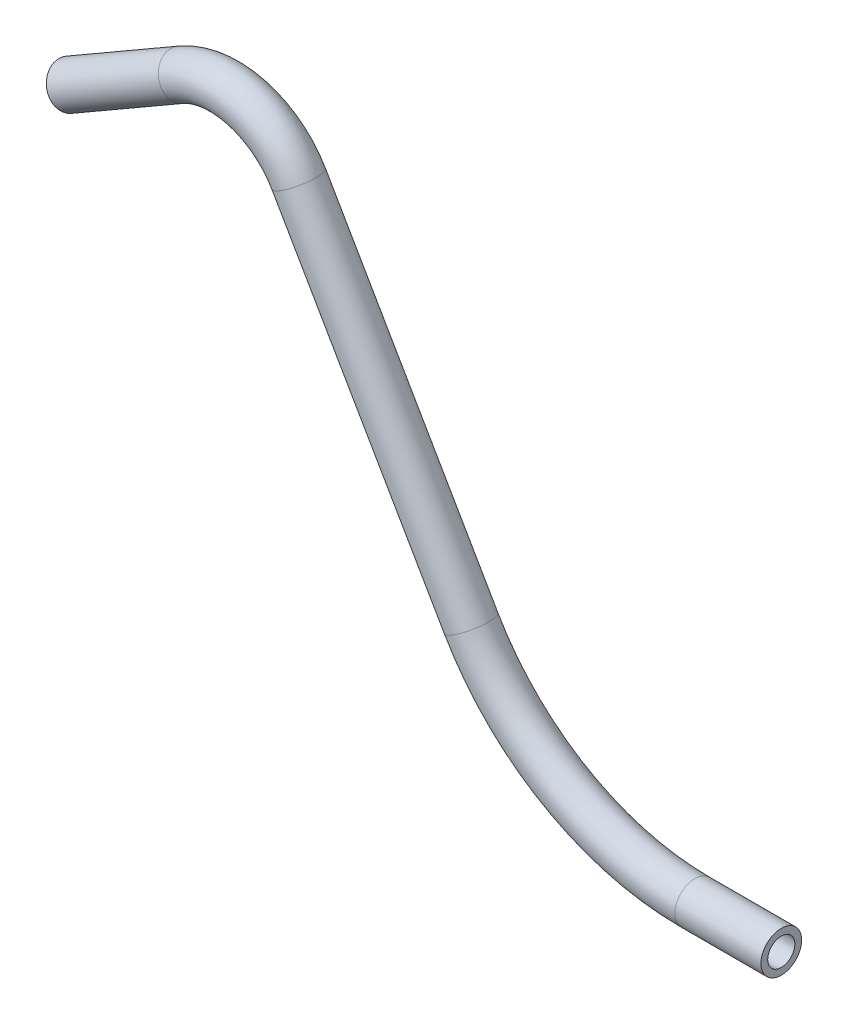
ISO-10303-21;
HEADER;
FILE_DESCRIPTION(('STEP AP214'),'2;1');
FILE_NAME('part.step','',(''),(''),'','','');
FILE_SCHEMA(('AUTOMOTIVE_DESIGN { 1 0 10303 214 1 1 1 1 }'));
ENDSEC;
DATA;
#1=APPLICATION_CONTEXT('core data for automotive mechanical design processes');
#2=APPLICATION_PROTOCOL_DEFINITION('international standard','automotive_design',2000,#1);
#3=PRODUCT_CONTEXT('',#1,'mechanical');
#4=PRODUCT('Part','Part','',(#3));
#5=PRODUCT_RELATED_PRODUCT_CATEGORY('part','',(#4));
#6=PRODUCT_DEFINITION_FORMATION('','',#4);
#7=PRODUCT_DEFINITION_CONTEXT('part definition',#1,'design');
#8=PRODUCT_DEFINITION('design','',#6,#7);
#9=PRODUCT_DEFINITION_SHAPE('','',#8);
#10=(LENGTH_UNIT() NAMED_UNIT(*) SI_UNIT(.MILLI.,.METRE.));
#11=(NAMED_UNIT(*) PLANE_ANGLE_UNIT() SI_UNIT($,.RADIAN.));
#12=(NAMED_UNIT(*) SI_UNIT($,.STERADIAN.) SOLID_ANGLE_UNIT());
#13=UNCERTAINTY_MEASURE_WITH_UNIT(LENGTH_MEASURE(1.E-05),#10,'distance_accuracy_value','');
#14=(GEOMETRIC_REPRESENTATION_CONTEXT(3) GLOBAL_UNCERTAINTY_ASSIGNED_CONTEXT((#13)) GLOBAL_UNIT_ASSIGNED_CONTEXT((#10,
#11,#12)) REPRESENTATION_CONTEXT('',''));
#15=CARTESIAN_POINT('',(0.,0.,0.));
#16=DIRECTION('',(0.,0.,1.));
#17=DIRECTION('',(1.,0.,0.));
#18=AXIS2_PLACEMENT_3D('',#15,#16,#17);
#19=CARTESIAN_POINT('',(-88.4440905122495,67.692613140312,0.));
#20=DIRECTION('',(-0.866025403784438,-0.5,0.));
#21=DIRECTION('',(0.5,-0.866025403784439,0.));
#22=AXIS2_PLACEMENT_3D('',#19,#20,#21);
#23=CYLINDRICAL_SURFACE('',#22,3.);
#24=CARTESIAN_POINT('',(-88.4440905122495,67.692613140312,0.));
#25=DIRECTION('',(0.866025403784439,0.5,0.));
#26=DIRECTION('',(0.,0.,-1.));
#27=AXIS2_PLACEMENT_3D('',#24,#25,#26);
#28=CIRCLE('',#27,3.);
#29=CARTESIAN_POINT('',(-89.9440905122495,70.2906893516653,0.));
#30=VERTEX_POINT('',#29);
#31=EDGE_CURVE('E42',#30,#30,#28,.T.);
#32=ORIENTED_EDGE('',*,*,#31,.F.);
#33=EDGE_LOOP('',(#32));
#34=FACE_BOUND('',#33,.T.);
#35=CARTESIAN_POINT('',(-104.941874454343,58.167613140312,0.));
#36=DIRECTION('',(0.866025403784439,0.5,0.));
#37=DIRECTION('',(0.,0.,-1.));
#38=AXIS2_PLACEMENT_3D('',#35,#36,#37);
#39=CIRCLE('',#38,3.);
#40=CARTESIAN_POINT('',(-104.941874454343,58.167613140312,-3.));
#41=VERTEX_POINT('',#40);
#42=EDGE_CURVE('E10',#41,#41,#39,.T.);
#43=ORIENTED_EDGE('',*,*,#42,.T.);
#44=EDGE_LOOP('',(#43));
#45=FACE_BOUND('',#44,.T.);
#46=ADVANCED_FACE('F32',(#34,#45),#23,.T.);
#47=CARTESIAN_POINT('',(-88.4440905122495,67.692613140312,0.));
#48=DIRECTION('',(-0.866025403784438,-0.5,0.));
#49=DIRECTION('',(0.5,-0.866025403784439,0.));
#50=AXIS2_PLACEMENT_3D('',#47,#48,#49);
#51=CYLINDRICAL_SURFACE('',#50,2.);
#52=CARTESIAN_POINT('',(-88.4440905122495,67.692613140312,0.));
#53=DIRECTION('',(0.866025403784439,0.5,0.));
#54=DIRECTION('',(0.,0.,-1.));
#55=AXIS2_PLACEMENT_3D('',#52,#53,#54);
#56=CIRCLE('',#55,2.);
#57=CARTESIAN_POINT('',(-89.4440905122495,69.4246639478809,0.));
#58=VERTEX_POINT('',#57);
#59=EDGE_CURVE('E46',#58,#58,#56,.T.);
#60=ORIENTED_EDGE('',*,*,#59,.T.);
#61=EDGE_LOOP('',(#60));
#62=FACE_BOUND('',#61,.T.);
#63=CARTESIAN_POINT('',(-104.941874454343,58.167613140312,0.));
#64=DIRECTION('',(0.866025403784439,0.5,0.));
#65=DIRECTION('',(0.,0.,-1.));
#66=AXIS2_PLACEMENT_3D('',#63,#64,#65);
#67=CIRCLE('',#66,2.);
#68=CARTESIAN_POINT('',(-104.941874454343,58.167613140312,-2.));
#69=VERTEX_POINT('',#68);
#70=EDGE_CURVE('E38',#69,#69,#67,.T.);
#71=ORIENTED_EDGE('',*,*,#70,.F.);
#72=EDGE_LOOP('',(#71));
#73=FACE_BOUND('',#72,.T.);
#74=ADVANCED_FACE('F101',(#62,#73),#51,.F.);
#75=CARTESIAN_POINT('',(-82.0940905122495,56.6940905122496,0.));
#76=DIRECTION('',(0.,0.,1.));
#77=DIRECTION('',(1.,0.,0.));
#78=AXIS2_PLACEMENT_3D('',#75,#76,#77);
#79=TOROIDAL_SURFACE('',#78,12.7,3.);
#80=CARTESIAN_POINT('',(-71.0955678841871,63.0440905122496,0.));
#81=DIRECTION('',(0.499999999999998,-0.86602540378444,0.));
#82=DIRECTION('',(0.,0.,-1.));
#83=AXIS2_PLACEMENT_3D('',#80,#81,#82);
#84=CIRCLE('',#83,3.);
#85=CARTESIAN_POINT('',(-68.4974916728337,64.5440905122496,0.));
#86=VERTEX_POINT('',#85);
#87=EDGE_CURVE('E51',#86,#86,#84,.T.);
#88=CARTESIAN_POINT('',(-82.0940905122495,56.6940905122496,0.));
#89=DIRECTION('',(0.,0.,1.));
#90=DIRECTION('',(1.,0.,0.));
#91=AXIS2_PLACEMENT_3D('',#88,#89,#90);
#92=CIRCLE('',#91,15.7);
#93=EDGE_CURVE('',#86,#30,#92,.T.);
#94=ORIENTED_EDGE('',*,*,#87,.F.);
#95=ORIENTED_EDGE('',*,*,#31,.T.);
#96=ORIENTED_EDGE('',*,*,#93,.T.);
#97=ORIENTED_EDGE('',*,*,#93,.F.);
#98=EDGE_LOOP('',(#94,#96,#95,#97));
#99=FACE_BOUND('',#98,.T.);
#100=ADVANCED_FACE('F106',(#99),#79,.T.);
#101=CARTESIAN_POINT('',(-82.0940905122495,56.6940905122496,0.));
#102=DIRECTION('',(0.,0.,1.));
#103=DIRECTION('',(1.,0.,0.));
#104=AXIS2_PLACEMENT_3D('',#101,#102,#103);
#105=TOROIDAL_SURFACE('',#104,12.7,2.);
#106=CARTESIAN_POINT('',(-71.0955678841871,63.0440905122496,0.));
#107=DIRECTION('',(0.499999999999998,-0.86602540378444,0.));
#108=DIRECTION('',(0.,0.,-1.));
#109=AXIS2_PLACEMENT_3D('',#106,#107,#108);
#110=CIRCLE('',#109,2.);
#111=CARTESIAN_POINT('',(-69.3635170766182,64.0440905122496,0.));
#112=VERTEX_POINT('',#111);
#113=EDGE_CURVE('E54',#112,#112,#110,.T.);
#114=CARTESIAN_POINT('',(-82.0940905122495,56.6940905122496,0.));
#115=DIRECTION('',(0.,0.,1.));
#116=DIRECTION('',(1.,0.,0.));
#117=AXIS2_PLACEMENT_3D('',#114,#115,#116);
#118=CIRCLE('',#117,14.7);
#119=EDGE_CURVE('',#112,#58,#118,.T.);
#120=ORIENTED_EDGE('',*,*,#113,.T.);
#121=ORIENTED_EDGE('',*,*,#59,.F.);
#122=ORIENTED_EDGE('',*,*,#119,.T.);
#123=ORIENTED_EDGE('',*,*,#119,.F.);
#124=EDGE_LOOP('',(#120,#122,#121,#123));
#125=FACE_BOUND('',#124,.T.);
#126=ADVANCED_FACE('F111',(#125),#105,.F.);
#127=CARTESIAN_POINT('',(-45.6955678841872,19.0500000000001,0.));
#128=DIRECTION('',(-0.499999999999998,0.86602540378444,0.));
#129=DIRECTION('',(-0.86602540378444,-0.499999999999998,0.));
#130=AXIS2_PLACEMENT_3D('',#127,#128,#129);
#131=CYLINDRICAL_SURFACE('',#130,3.);
#132=CARTESIAN_POINT('',(-45.6955678841872,19.0500000000001,0.));
#133=DIRECTION('',(0.499999999999998,-0.86602540378444,0.));
#134=DIRECTION('',(0.,0.,-1.));
#135=AXIS2_PLACEMENT_3D('',#132,#133,#134);
#136=CIRCLE('',#135,3.);
#137=CARTESIAN_POINT('',(-48.2936440955405,17.5500000000001,0.));
#138=VERTEX_POINT('',#137);
#139=EDGE_CURVE('E57',#138,#138,#136,.T.);
#140=ORIENTED_EDGE('',*,*,#139,.F.);
#141=EDGE_LOOP('',(#140));
#142=FACE_BOUND('',#141,.T.);
#143=ORIENTED_EDGE('',*,*,#87,.T.);
#144=EDGE_LOOP('',(#143));
#145=FACE_BOUND('',#144,.T.);
#146=ADVANCED_FACE('F117',(#142,#145),#131,.T.);
#147=CARTESIAN_POINT('',(-45.6955678841872,19.0500000000001,0.));
#148=DIRECTION('',(-0.499999999999998,0.86602540378444,0.));
#149=DIRECTION('',(-0.86602540378444,-0.499999999999998,0.));
#150=AXIS2_PLACEMENT_3D('',#147,#148,#149);
#151=CYLINDRICAL_SURFACE('',#150,2.);
#152=CARTESIAN_POINT('',(-45.6955678841872,19.0500000000001,0.));
#153=DIRECTION('',(0.499999999999998,-0.86602540378444,0.));
#154=DIRECTION('',(0.,0.,-1.));
#155=AXIS2_PLACEMENT_3D('',#152,#153,#154);
#156=CIRCLE('',#155,2.);
#157=CARTESIAN_POINT('',(-47.427618691756,18.0500000000001,0.));
#158=VERTEX_POINT('',#157);
#159=EDGE_CURVE('E60',#158,#158,#156,.T.);
#160=ORIENTED_EDGE('',*,*,#159,.T.);
#161=EDGE_LOOP('',(#160));
#162=FACE_BOUND('',#161,.T.);
#163=ORIENTED_EDGE('',*,*,#113,.F.);
#164=EDGE_LOOP('',(#163));
#165=FACE_BOUND('',#164,.T.);
#166=ADVANCED_FACE('F124',(#162,#165),#151,.F.);
#167=CARTESIAN_POINT('',(-12.7,38.1,0.));
#168=DIRECTION('',(0.,0.,-1.));
#169=DIRECTION('',(-1.,0.,0.));
#170=AXIS2_PLACEMENT_3D('',#167,#168,#169);
#171=TOROIDAL_SURFACE('',#170,38.1,3.);
#172=CARTESIAN_POINT('',(-12.7,0.,0.));
#173=DIRECTION('',(1.,0.,0.));
#174=DIRECTION('',(0.,0.,-1.));
#175=AXIS2_PLACEMENT_3D('',#172,#173,#174);
#176=CIRCLE('',#175,3.);
#177=CARTESIAN_POINT('',(-12.7,-3.,0.));
#178=VERTEX_POINT('',#177);
#179=EDGE_CURVE('E63',#178,#178,#176,.T.);
#180=CARTESIAN_POINT('',(-12.7,38.1,0.));
#181=DIRECTION('',(0.,0.,-1.));
#182=DIRECTION('',(-1.,0.,0.));
#183=AXIS2_PLACEMENT_3D('',#180,#181,#182);
#184=CIRCLE('',#183,41.1);
#185=EDGE_CURVE('',#178,#138,#184,.T.);
#186=ORIENTED_EDGE('',*,*,#179,.F.);
#187=ORIENTED_EDGE('',*,*,#139,.T.);
#188=ORIENTED_EDGE('',*,*,#185,.T.);
#189=ORIENTED_EDGE('',*,*,#185,.F.);
#190=EDGE_LOOP('',(#186,#188,#187,#189));
#191=FACE_BOUND('',#190,.T.);
#192=ADVANCED_FACE('F128',(#191),#171,.T.);
#193=CARTESIAN_POINT('',(-12.7,38.1,0.));
#194=DIRECTION('',(0.,0.,-1.));
#195=DIRECTION('',(-1.,0.,0.));
#196=AXIS2_PLACEMENT_3D('',#193,#194,#195);
#197=TOROIDAL_SURFACE('',#196,38.1,2.);
#198=CARTESIAN_POINT('',(-12.7,0.,0.));
#199=DIRECTION('',(1.,0.,0.));
#200=DIRECTION('',(0.,0.,-1.));
#201=AXIS2_PLACEMENT_3D('',#198,#199,#200);
#202=CIRCLE('',#201,2.);
#203=CARTESIAN_POINT('',(-12.7,-2.,0.));
#204=VERTEX_POINT('',#203);
#205=EDGE_CURVE('E67',#204,#204,#202,.T.);
#206=CARTESIAN_POINT('',(-12.7,38.1,0.));
#207=DIRECTION('',(0.,0.,-1.));
#208=DIRECTION('',(-1.,0.,0.));
#209=AXIS2_PLACEMENT_3D('',#206,#207,#208);
#210=CIRCLE('',#209,40.1);
#211=EDGE_CURVE('',#204,#158,#210,.T.);
#212=ORIENTED_EDGE('',*,*,#205,.T.);
#213=ORIENTED_EDGE('',*,*,#159,.F.);
#214=ORIENTED_EDGE('',*,*,#211,.T.);
#215=ORIENTED_EDGE('',*,*,#211,.F.);
#216=EDGE_LOOP('',(#212,#214,#213,#215));
#217=FACE_BOUND('',#216,.T.);
#218=ADVANCED_FACE('F76',(#217),#197,.F.);
#219=CARTESIAN_POINT('',(-12.7,0.,0.));
#220=DIRECTION('',(1.,0.,0.));
#221=DIRECTION('',(0.,1.,0.));
#222=AXIS2_PLACEMENT_3D('',#219,#220,#221);
#223=CYLINDRICAL_SURFACE('',#222,2.);
#224=ORIENTED_EDGE('',*,*,#205,.F.);
#225=EDGE_LOOP('',(#224));
#226=FACE_BOUND('',#225,.T.);
#227=CARTESIAN_POINT('',(0.,0.,0.));
#228=DIRECTION('',(1.,0.,0.));
#229=DIRECTION('',(0.,0.,-1.));
#230=AXIS2_PLACEMENT_3D('',#227,#228,#229);
#231=CIRCLE('',#230,2.);
#232=CARTESIAN_POINT('',(0.,0.,-2.));
#233=VERTEX_POINT('',#232);
#234=EDGE_CURVE('E68',#233,#233,#231,.T.);
#235=ORIENTED_EDGE('',*,*,#234,.T.);
#236=EDGE_LOOP('',(#235));
#237=FACE_BOUND('',#236,.T.);
#238=ADVANCED_FACE('F79',(#226,#237),#223,.F.);
#239=CARTESIAN_POINT('',(-12.7,0.,0.));
#240=DIRECTION('',(1.,0.,0.));
#241=DIRECTION('',(0.,1.,0.));
#242=AXIS2_PLACEMENT_3D('',#239,#240,#241);
#243=CYLINDRICAL_SURFACE('',#242,3.);
#244=ORIENTED_EDGE('',*,*,#179,.T.);
#245=EDGE_LOOP('',(#244));
#246=FACE_BOUND('',#245,.T.);
#247=CARTESIAN_POINT('',(0.,0.,0.));
#248=DIRECTION('',(1.,0.,0.));
#249=DIRECTION('',(0.,0.,-1.));
#250=AXIS2_PLACEMENT_3D('',#247,#248,#249);
#251=CIRCLE('',#250,3.);
#252=CARTESIAN_POINT('',(0.,0.,-3.));
#253=VERTEX_POINT('',#252);
#254=EDGE_CURVE('E64',#253,#253,#251,.T.);
#255=ORIENTED_EDGE('',*,*,#254,.F.);
#256=EDGE_LOOP('',(#255));
#257=FACE_BOUND('',#256,.T.);
#258=ADVANCED_FACE('F82',(#246,#257),#243,.T.);
#259=CARTESIAN_POINT('',(-104.941874454343,58.167613140312,0.));
#260=DIRECTION('',(0.866025403784439,0.5,0.));
#261=DIRECTION('',(0.,0.,-1.));
#262=AXIS2_PLACEMENT_3D('',#259,#260,#261);
#263=PLANE('',#262);
#264=ORIENTED_EDGE('',*,*,#70,.T.);
#265=EDGE_LOOP('',(#264));
#266=FACE_BOUND('',#265,.T.);
#267=ORIENTED_EDGE('',*,*,#42,.F.);
#268=EDGE_LOOP('',(#267));
#269=FACE_BOUND('',#268,.T.);
#270=ADVANCED_FACE('F89',(#266,#269),#263,.F.);
#271=CARTESIAN_POINT('',(0.,0.,0.));
#272=DIRECTION('',(1.,0.,0.));
#273=DIRECTION('',(0.,0.,-1.));
#274=AXIS2_PLACEMENT_3D('',#271,#272,#273);
#275=PLANE('',#274);
#276=ORIENTED_EDGE('',*,*,#234,.F.);
#277=EDGE_LOOP('',(#276));
#278=FACE_BOUND('',#277,.T.);
#279=ORIENTED_EDGE('',*,*,#254,.T.);
#280=EDGE_LOOP('',(#279));
#281=FACE_BOUND('',#280,.T.);
#282=ADVANCED_FACE('F86',(#278,#281),#275,.T.);
#283=CLOSED_SHELL('',(#46,#74,#100,#126,#146,#166,#192,#218,#238,#258,#270,#282));
#284=MANIFOLD_SOLID_BREP('B2',#283);
#285=ADVANCED_BREP_SHAPE_REPRESENTATION('',(#18,#284),#14);
#286=SHAPE_DEFINITION_REPRESENTATION(#9,#285);
ENDSEC;
END-ISO-10303-21;
